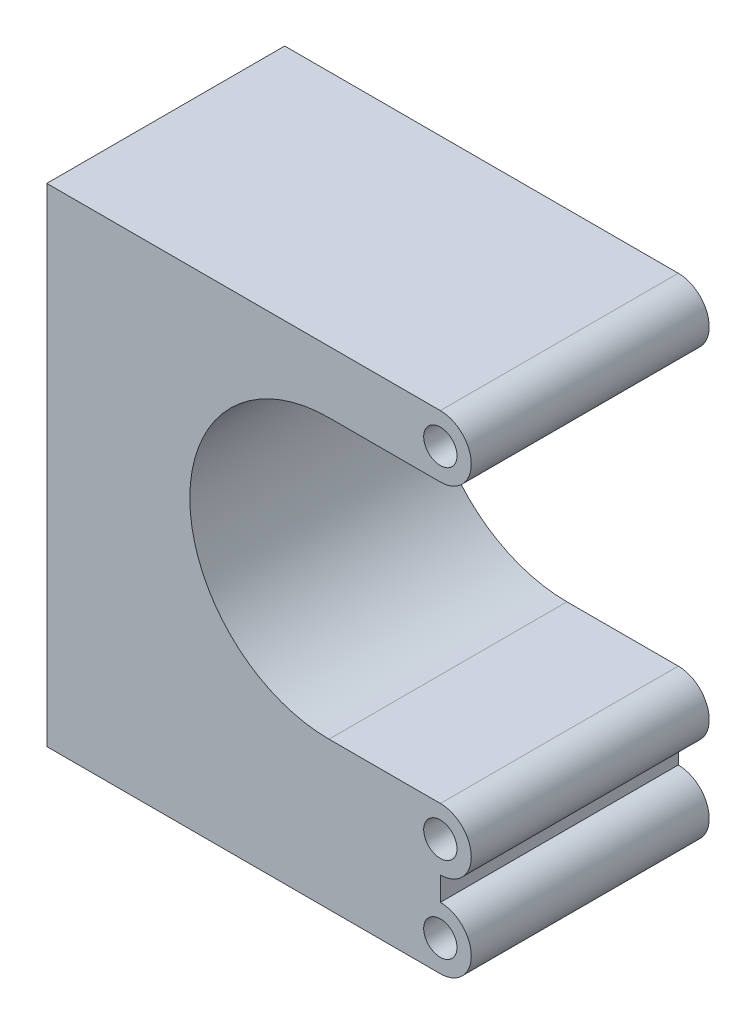
ISO-10303-21;
HEADER;
FILE_DESCRIPTION(('STEP AP214'),'2;1');
FILE_NAME('part.step','',(''),(''),'','','');
FILE_SCHEMA(('AUTOMOTIVE_DESIGN { 1 0 10303 214 1 1 1 1 }'));
ENDSEC;
DATA;
#1=APPLICATION_CONTEXT('core data for automotive mechanical design processes');
#2=APPLICATION_PROTOCOL_DEFINITION('international standard','automotive_design',2000,#1);
#3=PRODUCT_CONTEXT('',#1,'mechanical');
#4=PRODUCT('Part','Part','',(#3));
#5=PRODUCT_RELATED_PRODUCT_CATEGORY('part','',(#4));
#6=PRODUCT_DEFINITION_FORMATION('','',#4);
#7=PRODUCT_DEFINITION_CONTEXT('part definition',#1,'design');
#8=PRODUCT_DEFINITION('design','',#6,#7);
#9=PRODUCT_DEFINITION_SHAPE('','',#8);
#10=(LENGTH_UNIT() NAMED_UNIT(*) SI_UNIT(.MILLI.,.METRE.));
#11=(NAMED_UNIT(*) PLANE_ANGLE_UNIT() SI_UNIT($,.RADIAN.));
#12=(NAMED_UNIT(*) SI_UNIT($,.STERADIAN.) SOLID_ANGLE_UNIT());
#13=UNCERTAINTY_MEASURE_WITH_UNIT(LENGTH_MEASURE(1.E-05),#10,'distance_accuracy_value','');
#14=(GEOMETRIC_REPRESENTATION_CONTEXT(3) GLOBAL_UNCERTAINTY_ASSIGNED_CONTEXT((#13)) GLOBAL_UNIT_ASSIGNED_CONTEXT((#10,
#11,#12)) REPRESENTATION_CONTEXT('',''));
#15=CARTESIAN_POINT('',(0.,0.,0.));
#16=DIRECTION('',(0.,0.,1.));
#17=DIRECTION('',(1.,0.,0.));
#18=AXIS2_PLACEMENT_3D('',#15,#16,#17);
#19=CARTESIAN_POINT('',(0.,0.,25.4));
#20=DIRECTION('',(1.,0.,0.));
#21=DIRECTION('',(0.,1.,0.));
#22=AXIS2_PLACEMENT_3D('',#19,#20,#21);
#23=PLANE('',#22);
#24=DIRECTION('',(0.,-1.,0.));
#25=VECTOR('',#24,1.);
#26=CARTESIAN_POINT('',(0.,0.,0.));
#27=LINE('',#26,#25);
#28=CARTESIAN_POINT('',(0.,0.,0.));
#29=VERTEX_POINT('',#28);
#30=CARTESIAN_POINT('',(0.,-52.07,0.));
#31=VERTEX_POINT('',#30);
#32=EDGE_CURVE('E159',#29,#31,#27,.T.);
#33=ORIENTED_EDGE('',*,*,#32,.T.);
#34=DIRECTION('',(0.,0.,-1.));
#35=VECTOR('',#34,1.);
#36=CARTESIAN_POINT('',(0.,-52.07,25.4));
#37=LINE('',#36,#35);
#38=CARTESIAN_POINT('',(0.,-52.07,25.4));
#39=VERTEX_POINT('',#38);
#40=EDGE_CURVE('E11',#39,#31,#37,.T.);
#41=ORIENTED_EDGE('',*,*,#40,.F.);
#42=DIRECTION('',(0.,-1.,0.));
#43=VECTOR('',#42,1.);
#44=CARTESIAN_POINT('',(0.,0.,25.4));
#45=LINE('',#44,#43);
#46=CARTESIAN_POINT('',(0.,0.,25.4));
#47=VERTEX_POINT('',#46);
#48=EDGE_CURVE('E171',#47,#39,#45,.T.);
#49=ORIENTED_EDGE('',*,*,#48,.F.);
#50=DIRECTION('',(0.,0.,-1.));
#51=VECTOR('',#50,1.);
#52=CARTESIAN_POINT('',(0.,0.,25.4));
#53=LINE('',#52,#51);
#54=EDGE_CURVE('E172',#47,#29,#53,.T.);
#55=ORIENTED_EDGE('',*,*,#54,.T.);
#56=EDGE_LOOP('',(#33,#41,#49,#55));
#57=FACE_BOUND('',#56,.T.);
#58=ADVANCED_FACE('F43',(#57),#23,.F.);
#59=CARTESIAN_POINT('',(0.,-52.07,25.4));
#60=DIRECTION('',(0.,1.,0.));
#61=DIRECTION('',(0.,0.,1.));
#62=AXIS2_PLACEMENT_3D('',#59,#60,#61);
#63=PLANE('',#62);
#64=DIRECTION('',(1.,0.,0.));
#65=VECTOR('',#64,1.);
#66=CARTESIAN_POINT('',(0.,-52.07,0.));
#67=LINE('',#66,#65);
#68=CARTESIAN_POINT('',(42.0126551419847,-52.07,0.));
#69=VERTEX_POINT('',#68);
#70=EDGE_CURVE('E153',#31,#69,#67,.T.);
#71=ORIENTED_EDGE('',*,*,#70,.T.);
#72=DIRECTION('',(0.,0.,-1.));
#73=VECTOR('',#72,1.);
#74=CARTESIAN_POINT('',(42.0126551419847,-52.07,25.4));
#75=LINE('',#74,#73);
#76=CARTESIAN_POINT('',(42.0126551419847,-52.07,25.4));
#77=VERTEX_POINT('',#76);
#78=EDGE_CURVE('E51',#77,#69,#75,.T.);
#79=ORIENTED_EDGE('',*,*,#78,.F.);
#80=DIRECTION('',(1.,0.,0.));
#81=VECTOR('',#80,1.);
#82=CARTESIAN_POINT('',(0.,-52.07,25.4));
#83=LINE('',#82,#81);
#84=EDGE_CURVE('E100',#39,#77,#83,.T.);
#85=ORIENTED_EDGE('',*,*,#84,.F.);
#86=ORIENTED_EDGE('',*,*,#40,.T.);
#87=EDGE_LOOP('',(#71,#79,#85,#86));
#88=FACE_BOUND('',#87,.T.);
#89=ADVANCED_FACE('F278',(#88),#63,.F.);
#90=CARTESIAN_POINT('',(42.0126551419847,-36.322,25.4));
#91=DIRECTION('',(-1.,0.,0.));
#92=DIRECTION('',(0.,0.,1.));
#93=AXIS2_PLACEMENT_3D('',#90,#91,#92);
#94=PLANE('',#93);
#95=DIRECTION('',(0.,1.,0.));
#96=VECTOR('',#95,1.);
#97=CARTESIAN_POINT('',(42.0126551419847,-36.322,25.4));
#98=LINE('',#97,#96);
#99=CARTESIAN_POINT('',(42.0126551419847,-45.466,25.4));
#100=VERTEX_POINT('',#99);
#101=CARTESIAN_POINT('',(42.0126551419847,-42.926,25.4));
#102=VERTEX_POINT('',#101);
#103=EDGE_CURVE('E144',#100,#102,#98,.T.);
#104=ORIENTED_EDGE('',*,*,#103,.F.);
#105=DIRECTION('',(0.,0.,1.));
#106=VECTOR('',#105,1.);
#107=CARTESIAN_POINT('',(42.0126551419847,-45.466,0.));
#108=LINE('',#107,#106);
#109=CARTESIAN_POINT('',(42.0126551419847,-45.466,0.));
#110=VERTEX_POINT('',#109);
#111=EDGE_CURVE('E131',#100,#110,#108,.F.);
#112=ORIENTED_EDGE('',*,*,#111,.T.);
#113=DIRECTION('',(0.,1.,0.));
#114=VECTOR('',#113,1.);
#115=CARTESIAN_POINT('',(42.0126551419847,-36.322,0.));
#116=LINE('',#115,#114);
#117=CARTESIAN_POINT('',(42.0126551419847,-42.926,0.));
#118=VERTEX_POINT('',#117);
#119=EDGE_CURVE('E142',#110,#118,#116,.T.);
#120=ORIENTED_EDGE('',*,*,#119,.T.);
#121=DIRECTION('',(0.,0.,1.));
#122=VECTOR('',#121,1.);
#123=CARTESIAN_POINT('',(42.0126551419847,-42.926,0.));
#124=LINE('',#123,#122);
#125=EDGE_CURVE('E225',#118,#102,#124,.T.);
#126=ORIENTED_EDGE('',*,*,#125,.T.);
#127=EDGE_LOOP('',(#104,#112,#120,#126));
#128=FACE_BOUND('',#127,.T.);
#129=ADVANCED_FACE('F140',(#128),#94,.F.);
#130=CARTESIAN_POINT('',(42.0126551419847,-36.322,25.4));
#131=DIRECTION('',(0.,-1.,0.));
#132=DIRECTION('',(0.,0.,-1.));
#133=AXIS2_PLACEMENT_3D('',#130,#131,#132);
#134=PLANE('',#133);
#135=DIRECTION('',(-1.,0.,0.));
#136=VECTOR('',#135,1.);
#137=CARTESIAN_POINT('',(42.0126551419847,-36.322,0.));
#138=LINE('',#137,#136);
#139=CARTESIAN_POINT('',(42.0126551419847,-36.322,0.));
#140=VERTEX_POINT('',#139);
#141=CARTESIAN_POINT('',(30.1281900458422,-36.322,0.));
#142=VERTEX_POINT('',#141);
#143=EDGE_CURVE('E152',#140,#142,#138,.T.);
#144=ORIENTED_EDGE('',*,*,#143,.T.);
#145=DIRECTION('',(0.,0.,-1.));
#146=VECTOR('',#145,1.);
#147=CARTESIAN_POINT('',(30.1281900458422,-36.322,25.4));
#148=LINE('',#147,#146);
#149=CARTESIAN_POINT('',(30.1281900458422,-36.322,25.4));
#150=VERTEX_POINT('',#149);
#151=EDGE_CURVE('E185',#150,#142,#148,.T.);
#152=ORIENTED_EDGE('',*,*,#151,.F.);
#153=DIRECTION('',(-1.,0.,0.));
#154=VECTOR('',#153,1.);
#155=CARTESIAN_POINT('',(42.0126551419847,-36.322,25.4));
#156=LINE('',#155,#154);
#157=CARTESIAN_POINT('',(42.0126551419847,-36.322,25.4));
#158=VERTEX_POINT('',#157);
#159=EDGE_CURVE('E202',#158,#150,#156,.T.);
#160=ORIENTED_EDGE('',*,*,#159,.F.);
#161=DIRECTION('',(0.,0.,-1.));
#162=VECTOR('',#161,1.);
#163=CARTESIAN_POINT('',(42.0126551419847,-36.322,25.4));
#164=LINE('',#163,#162);
#165=EDGE_CURVE('E189',#158,#140,#164,.T.);
#166=ORIENTED_EDGE('',*,*,#165,.T.);
#167=EDGE_LOOP('',(#144,#152,#160,#166));
#168=FACE_BOUND('',#167,.T.);
#169=ADVANCED_FACE('F291',(#168),#134,.F.);
#170=CARTESIAN_POINT('',(30.1281900458422,-21.463,25.4));
#171=DIRECTION('',(0.,0.,-1.));
#172=DIRECTION('',(-1.,0.,0.));
#173=AXIS2_PLACEMENT_3D('',#170,#171,#172);
#174=CYLINDRICAL_SURFACE('',#173,14.859);
#175=CARTESIAN_POINT('',(30.1281900458422,-21.463,0.));
#176=DIRECTION('',(0.,0.,-1.));
#177=DIRECTION('',(1.,0.,0.));
#178=AXIS2_PLACEMENT_3D('',#175,#176,#177);
#179=CIRCLE('',#178,14.859);
#180=CARTESIAN_POINT('',(30.1281900458422,-6.604,0.));
#181=VERTEX_POINT('',#180);
#182=EDGE_CURVE('E157',#142,#181,#179,.T.);
#183=ORIENTED_EDGE('',*,*,#182,.T.);
#184=DIRECTION('',(0.,0.,-1.));
#185=VECTOR('',#184,1.);
#186=CARTESIAN_POINT('',(30.1281900458422,-6.604,25.4));
#187=LINE('',#186,#185);
#188=CARTESIAN_POINT('',(30.1281900458422,-6.604,25.4));
#189=VERTEX_POINT('',#188);
#190=EDGE_CURVE('E181',#189,#181,#187,.T.);
#191=ORIENTED_EDGE('',*,*,#190,.F.);
#192=CARTESIAN_POINT('',(30.1281900458422,-21.463,25.4));
#193=DIRECTION('',(0.,0.,-1.));
#194=DIRECTION('',(1.,0.,0.));
#195=AXIS2_PLACEMENT_3D('',#192,#193,#194);
#196=CIRCLE('',#195,14.859);
#197=EDGE_CURVE('E199',#150,#189,#196,.T.);
#198=ORIENTED_EDGE('',*,*,#197,.F.);
#199=ORIENTED_EDGE('',*,*,#151,.T.);
#200=EDGE_LOOP('',(#183,#191,#198,#199));
#201=FACE_BOUND('',#200,.T.);
#202=ADVANCED_FACE('F288',(#201),#174,.F.);
#203=CARTESIAN_POINT('',(42.0126551419847,-6.604,25.4));
#204=DIRECTION('',(0.,1.,0.));
#205=DIRECTION('',(-1.,0.,0.));
#206=AXIS2_PLACEMENT_3D('',#203,#204,#205);
#207=PLANE('',#206);
#208=DIRECTION('',(1.,0.,0.));
#209=VECTOR('',#208,1.);
#210=CARTESIAN_POINT('',(42.0126551419847,-6.604,0.));
#211=LINE('',#210,#209);
#212=CARTESIAN_POINT('',(42.0126551419847,-6.604,0.));
#213=VERTEX_POINT('',#212);
#214=EDGE_CURVE('E165',#181,#213,#211,.T.);
#215=ORIENTED_EDGE('',*,*,#214,.T.);
#216=DIRECTION('',(0.,0.,-1.));
#217=VECTOR('',#216,1.);
#218=CARTESIAN_POINT('',(42.0126551419847,-6.604,25.4));
#219=LINE('',#218,#217);
#220=CARTESIAN_POINT('',(42.0126551419847,-6.604,25.4));
#221=VERTEX_POINT('',#220);
#222=EDGE_CURVE('E178',#221,#213,#219,.T.);
#223=ORIENTED_EDGE('',*,*,#222,.F.);
#224=DIRECTION('',(1.,0.,0.));
#225=VECTOR('',#224,1.);
#226=CARTESIAN_POINT('',(42.0126551419847,-6.604,25.4));
#227=LINE('',#226,#225);
#228=EDGE_CURVE('E195',#189,#221,#227,.T.);
#229=ORIENTED_EDGE('',*,*,#228,.F.);
#230=ORIENTED_EDGE('',*,*,#190,.T.);
#231=EDGE_LOOP('',(#215,#223,#229,#230));
#232=FACE_BOUND('',#231,.T.);
#233=ADVANCED_FACE('F283',(#232),#207,.F.);
#234=CARTESIAN_POINT('',(0.,0.,25.4));
#235=DIRECTION('',(0.,-1.,0.));
#236=DIRECTION('',(0.,0.,-1.));
#237=AXIS2_PLACEMENT_3D('',#234,#235,#236);
#238=PLANE('',#237);
#239=DIRECTION('',(-1.,0.,0.));
#240=VECTOR('',#239,1.);
#241=CARTESIAN_POINT('',(0.,0.,0.));
#242=LINE('',#241,#240);
#243=CARTESIAN_POINT('',(42.0126551419847,0.,0.));
#244=VERTEX_POINT('',#243);
#245=EDGE_CURVE('E94',#244,#29,#242,.T.);
#246=ORIENTED_EDGE('',*,*,#245,.T.);
#247=ORIENTED_EDGE('',*,*,#54,.F.);
#248=DIRECTION('',(-1.,0.,0.));
#249=VECTOR('',#248,1.);
#250=CARTESIAN_POINT('',(0.,0.,25.4));
#251=LINE('',#250,#249);
#252=CARTESIAN_POINT('',(42.0126551419847,0.,25.4));
#253=VERTEX_POINT('',#252);
#254=EDGE_CURVE('E66',#253,#47,#251,.T.);
#255=ORIENTED_EDGE('',*,*,#254,.F.);
#256=DIRECTION('',(0.,0.,-1.));
#257=VECTOR('',#256,1.);
#258=CARTESIAN_POINT('',(42.0126551419847,0.,25.4));
#259=LINE('',#258,#257);
#260=EDGE_CURVE('E175',#253,#244,#259,.T.);
#261=ORIENTED_EDGE('',*,*,#260,.T.);
#262=EDGE_LOOP('',(#246,#247,#255,#261));
#263=FACE_BOUND('',#262,.T.);
#264=ADVANCED_FACE('F273',(#263),#238,.F.);
#265=CARTESIAN_POINT('',(30.1281900458422,-21.463,25.4));
#266=DIRECTION('',(0.,0.,1.));
#267=DIRECTION('',(1.,0.,0.));
#268=AXIS2_PLACEMENT_3D('',#265,#266,#267);
#269=PLANE('',#268);
#270=CARTESIAN_POINT('',(42.0126551419847,-3.302,25.4));
#271=DIRECTION('',(0.,0.,1.));
#272=DIRECTION('',(1.,0.,0.));
#273=AXIS2_PLACEMENT_3D('',#270,#271,#272);
#274=CIRCLE('',#273,1.778);
#275=CARTESIAN_POINT('',(43.7906551419847,-3.302,25.4));
#276=VERTEX_POINT('',#275);
#277=EDGE_CURVE('E253',#276,#276,#274,.T.);
#278=ORIENTED_EDGE('',*,*,#277,.F.);
#279=EDGE_LOOP('',(#278));
#280=FACE_BOUND('',#279,.T.);
#281=CARTESIAN_POINT('',(42.0126551419847,-39.624,25.4));
#282=DIRECTION('',(0.,0.,1.));
#283=DIRECTION('',(1.,0.,0.));
#284=AXIS2_PLACEMENT_3D('',#281,#282,#283);
#285=CIRCLE('',#284,1.778);
#286=CARTESIAN_POINT('',(43.7906551419847,-39.624,25.4));
#287=VERTEX_POINT('',#286);
#288=EDGE_CURVE('E249',#287,#287,#285,.T.);
#289=ORIENTED_EDGE('',*,*,#288,.F.);
#290=EDGE_LOOP('',(#289));
#291=FACE_BOUND('',#290,.T.);
#292=CARTESIAN_POINT('',(42.0126551419847,-48.768,25.4));
#293=DIRECTION('',(0.,0.,1.));
#294=DIRECTION('',(1.,0.,0.));
#295=AXIS2_PLACEMENT_3D('',#292,#293,#294);
#296=CIRCLE('',#295,1.778);
#297=CARTESIAN_POINT('',(43.7906551419847,-48.768,25.4));
#298=VERTEX_POINT('',#297);
#299=EDGE_CURVE('E241',#298,#298,#296,.T.);
#300=ORIENTED_EDGE('',*,*,#299,.F.);
#301=EDGE_LOOP('',(#300));
#302=FACE_BOUND('',#301,.T.);
#303=ORIENTED_EDGE('',*,*,#84,.T.);
#304=CARTESIAN_POINT('',(42.0126551419847,-48.768,25.4));
#305=DIRECTION('',(0.,0.,1.));
#306=DIRECTION('',(1.,0.,0.));
#307=AXIS2_PLACEMENT_3D('',#304,#305,#306);
#308=CIRCLE('',#307,3.302);
#309=EDGE_CURVE('E58',#77,#100,#308,.T.);
#310=ORIENTED_EDGE('',*,*,#309,.T.);
#311=ORIENTED_EDGE('',*,*,#103,.T.);
#312=CARTESIAN_POINT('',(42.0126551419847,-39.624,25.4));
#313=DIRECTION('',(0.,0.,1.));
#314=DIRECTION('',(1.,0.,0.));
#315=AXIS2_PLACEMENT_3D('',#312,#313,#314);
#316=CIRCLE('',#315,3.302);
#317=EDGE_CURVE('E229',#102,#158,#316,.T.);
#318=ORIENTED_EDGE('',*,*,#317,.T.);
#319=ORIENTED_EDGE('',*,*,#159,.T.);
#320=ORIENTED_EDGE('',*,*,#197,.T.);
#321=ORIENTED_EDGE('',*,*,#228,.T.);
#322=CARTESIAN_POINT('',(42.0126551419847,-3.302,25.4));
#323=DIRECTION('',(0.,0.,1.));
#324=DIRECTION('',(1.,0.,0.));
#325=AXIS2_PLACEMENT_3D('',#322,#323,#324);
#326=CIRCLE('',#325,3.302);
#327=EDGE_CURVE('E214',#221,#253,#326,.T.);
#328=ORIENTED_EDGE('',*,*,#327,.T.);
#329=ORIENTED_EDGE('',*,*,#254,.T.);
#330=ORIENTED_EDGE('',*,*,#48,.T.);
#331=EDGE_LOOP('',(#303,#310,#311,#318,#319,#320,#321,#328,#329,#330));
#332=FACE_BOUND('',#331,.T.);
#333=ADVANCED_FACE('F270',(#280,#291,#302,#332),#269,.T.);
#334=CARTESIAN_POINT('',(30.1281900458422,-21.463,0.));
#335=DIRECTION('',(0.,0.,1.));
#336=DIRECTION('',(1.,0.,0.));
#337=AXIS2_PLACEMENT_3D('',#334,#335,#336);
#338=PLANE('',#337);
#339=CARTESIAN_POINT('',(42.0126551419847,-3.302,0.));
#340=DIRECTION('',(0.,0.,1.));
#341=DIRECTION('',(1.,0.,0.));
#342=AXIS2_PLACEMENT_3D('',#339,#340,#341);
#343=CIRCLE('',#342,1.778);
#344=CARTESIAN_POINT('',(43.7906551419847,-3.302,0.));
#345=VERTEX_POINT('',#344);
#346=EDGE_CURVE('E137',#345,#345,#343,.T.);
#347=ORIENTED_EDGE('',*,*,#346,.T.);
#348=EDGE_LOOP('',(#347));
#349=FACE_BOUND('',#348,.T.);
#350=CARTESIAN_POINT('',(42.0126551419847,-39.624,0.));
#351=DIRECTION('',(0.,0.,1.));
#352=DIRECTION('',(1.,0.,0.));
#353=AXIS2_PLACEMENT_3D('',#350,#351,#352);
#354=CIRCLE('',#353,1.778);
#355=CARTESIAN_POINT('',(43.7906551419847,-39.624,0.));
#356=VERTEX_POINT('',#355);
#357=EDGE_CURVE('E245',#356,#356,#354,.T.);
#358=ORIENTED_EDGE('',*,*,#357,.T.);
#359=EDGE_LOOP('',(#358));
#360=FACE_BOUND('',#359,.T.);
#361=CARTESIAN_POINT('',(42.0126551419847,-48.768,0.));
#362=DIRECTION('',(0.,0.,1.));
#363=DIRECTION('',(1.,0.,0.));
#364=AXIS2_PLACEMENT_3D('',#361,#362,#363);
#365=CIRCLE('',#364,1.778);
#366=CARTESIAN_POINT('',(43.7906551419847,-48.768,0.));
#367=VERTEX_POINT('',#366);
#368=EDGE_CURVE('E237',#367,#367,#365,.T.);
#369=ORIENTED_EDGE('',*,*,#368,.T.);
#370=EDGE_LOOP('',(#369));
#371=FACE_BOUND('',#370,.T.);
#372=ORIENTED_EDGE('',*,*,#119,.F.);
#373=CARTESIAN_POINT('',(42.0126551419847,-48.768,0.));
#374=DIRECTION('',(0.,0.,1.));
#375=DIRECTION('',(1.,0.,0.));
#376=AXIS2_PLACEMENT_3D('',#373,#374,#375);
#377=CIRCLE('',#376,3.302);
#378=EDGE_CURVE('E128',#69,#110,#377,.T.);
#379=ORIENTED_EDGE('',*,*,#378,.F.);
#380=ORIENTED_EDGE('',*,*,#70,.F.);
#381=ORIENTED_EDGE('',*,*,#32,.F.);
#382=ORIENTED_EDGE('',*,*,#245,.F.);
#383=CARTESIAN_POINT('',(42.0126551419847,-3.302,0.));
#384=DIRECTION('',(0.,0.,1.));
#385=DIRECTION('',(1.,0.,0.));
#386=AXIS2_PLACEMENT_3D('',#383,#384,#385);
#387=CIRCLE('',#386,3.302);
#388=EDGE_CURVE('E218',#213,#244,#387,.T.);
#389=ORIENTED_EDGE('',*,*,#388,.F.);
#390=ORIENTED_EDGE('',*,*,#214,.F.);
#391=ORIENTED_EDGE('',*,*,#182,.F.);
#392=ORIENTED_EDGE('',*,*,#143,.F.);
#393=CARTESIAN_POINT('',(42.0126551419847,-39.624,0.));
#394=DIRECTION('',(0.,0.,1.));
#395=DIRECTION('',(1.,0.,0.));
#396=AXIS2_PLACEMENT_3D('',#393,#394,#395);
#397=CIRCLE('',#396,3.302);
#398=EDGE_CURVE('E146',#118,#140,#397,.T.);
#399=ORIENTED_EDGE('',*,*,#398,.F.);
#400=EDGE_LOOP('',(#372,#379,#380,#381,#382,#389,#390,#391,#392,#399));
#401=FACE_BOUND('',#400,.T.);
#402=ADVANCED_FACE('F149',(#349,#360,#371,#401),#338,.F.);
#403=CARTESIAN_POINT('',(42.0126551419847,-3.302,0.));
#404=DIRECTION('',(0.,0.,1.));
#405=DIRECTION('',(1.,0.,0.));
#406=AXIS2_PLACEMENT_3D('',#403,#404,#405);
#407=CYLINDRICAL_SURFACE('',#406,3.302);
#408=ORIENTED_EDGE('',*,*,#222,.T.);
#409=ORIENTED_EDGE('',*,*,#388,.T.);
#410=ORIENTED_EDGE('',*,*,#260,.F.);
#411=ORIENTED_EDGE('',*,*,#327,.F.);
#412=EDGE_LOOP('',(#408,#409,#410,#411));
#413=FACE_BOUND('',#412,.T.);
#414=ADVANCED_FACE('F314',(#413),#407,.T.);
#415=CARTESIAN_POINT('',(42.0126551419847,-39.624,0.));
#416=DIRECTION('',(0.,0.,1.));
#417=DIRECTION('',(1.,0.,0.));
#418=AXIS2_PLACEMENT_3D('',#415,#416,#417);
#419=CYLINDRICAL_SURFACE('',#418,3.302);
#420=ORIENTED_EDGE('',*,*,#125,.F.);
#421=ORIENTED_EDGE('',*,*,#398,.T.);
#422=ORIENTED_EDGE('',*,*,#165,.F.);
#423=ORIENTED_EDGE('',*,*,#317,.F.);
#424=EDGE_LOOP('',(#420,#421,#422,#423));
#425=FACE_BOUND('',#424,.T.);
#426=ADVANCED_FACE('F295',(#425),#419,.T.);
#427=CARTESIAN_POINT('',(42.0126551419847,-48.768,0.));
#428=DIRECTION('',(0.,0.,1.));
#429=DIRECTION('',(1.,0.,0.));
#430=AXIS2_PLACEMENT_3D('',#427,#428,#429);
#431=CYLINDRICAL_SURFACE('',#430,3.302);
#432=ORIENTED_EDGE('',*,*,#78,.T.);
#433=ORIENTED_EDGE('',*,*,#378,.T.);
#434=ORIENTED_EDGE('',*,*,#111,.F.);
#435=ORIENTED_EDGE('',*,*,#309,.F.);
#436=EDGE_LOOP('',(#432,#433,#434,#435));
#437=FACE_BOUND('',#436,.T.);
#438=ADVANCED_FACE('F130',(#437),#431,.T.);
#439=CARTESIAN_POINT('',(42.0126551419847,-48.768,0.));
#440=DIRECTION('',(0.,0.,1.));
#441=DIRECTION('',(1.,0.,0.));
#442=AXIS2_PLACEMENT_3D('',#439,#440,#441);
#443=CYLINDRICAL_SURFACE('',#442,1.778);
#444=ORIENTED_EDGE('',*,*,#368,.F.);
#445=EDGE_LOOP('',(#444));
#446=FACE_BOUND('',#445,.T.);
#447=ORIENTED_EDGE('',*,*,#299,.T.);
#448=EDGE_LOOP('',(#447));
#449=FACE_BOUND('',#448,.T.);
#450=ADVANCED_FACE('F322',(#446,#449),#443,.F.);
#451=CARTESIAN_POINT('',(42.0126551419847,-39.624,0.));
#452=DIRECTION('',(0.,0.,1.));
#453=DIRECTION('',(1.,0.,0.));
#454=AXIS2_PLACEMENT_3D('',#451,#452,#453);
#455=CYLINDRICAL_SURFACE('',#454,1.778);
#456=ORIENTED_EDGE('',*,*,#357,.F.);
#457=EDGE_LOOP('',(#456));
#458=FACE_BOUND('',#457,.T.);
#459=ORIENTED_EDGE('',*,*,#288,.T.);
#460=EDGE_LOOP('',(#459));
#461=FACE_BOUND('',#460,.T.);
#462=ADVANCED_FACE('F266',(#458,#461),#455,.F.);
#463=CARTESIAN_POINT('',(42.0126551419847,-3.302,0.));
#464=DIRECTION('',(0.,0.,1.));
#465=DIRECTION('',(1.,0.,0.));
#466=AXIS2_PLACEMENT_3D('',#463,#464,#465);
#467=CYLINDRICAL_SURFACE('',#466,1.778);
#468=ORIENTED_EDGE('',*,*,#346,.F.);
#469=EDGE_LOOP('',(#468));
#470=FACE_BOUND('',#469,.T.);
#471=ORIENTED_EDGE('',*,*,#277,.T.);
#472=EDGE_LOOP('',(#471));
#473=FACE_BOUND('',#472,.T.);
#474=ADVANCED_FACE('F263',(#470,#473),#467,.F.);
#475=CLOSED_SHELL('',(#58,#89,#129,#169,#202,#233,#264,#333,#402,#414,#426,#438,#450,#462,#474));
#476=MANIFOLD_SOLID_BREP('B2',#475);
#477=ADVANCED_BREP_SHAPE_REPRESENTATION('',(#18,#476),#14);
#478=SHAPE_DEFINITION_REPRESENTATION(#9,#477);
ENDSEC;
END-ISO-10303-21;
